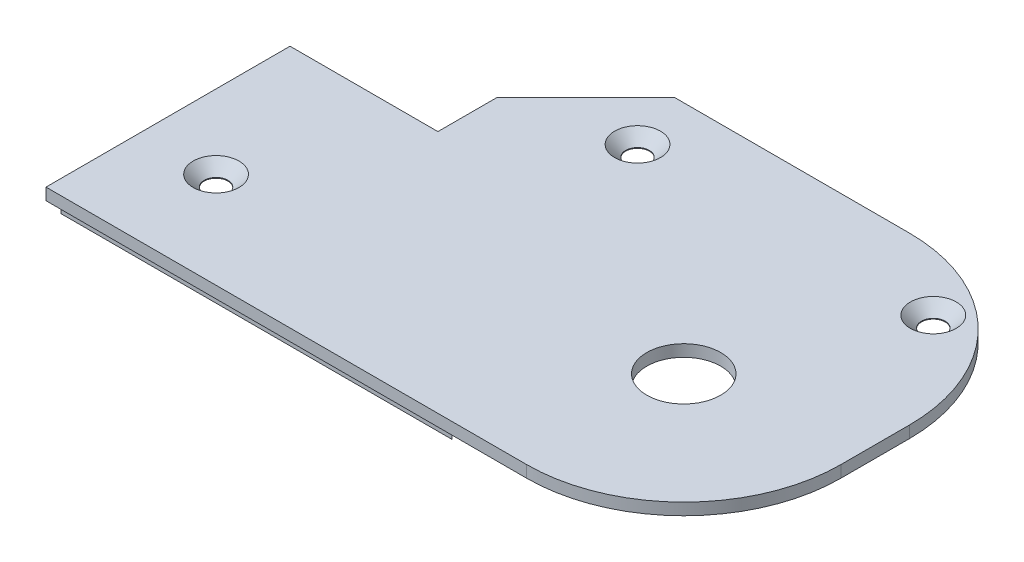
ISO-10303-21;
HEADER;
FILE_DESCRIPTION(('STEP AP214'),'2;1');
FILE_NAME('part.step','',(''),(''),'','','');
FILE_SCHEMA(('AUTOMOTIVE_DESIGN { 1 0 10303 214 1 1 1 1 }'));
ENDSEC;
DATA;
#1=APPLICATION_CONTEXT('core data for automotive mechanical design processes');
#2=APPLICATION_PROTOCOL_DEFINITION('international standard','automotive_design',2000,#1);
#3=PRODUCT_CONTEXT('',#1,'mechanical');
#4=PRODUCT('Part','Part','',(#3));
#5=PRODUCT_RELATED_PRODUCT_CATEGORY('part','',(#4));
#6=PRODUCT_DEFINITION_FORMATION('','',#4);
#7=PRODUCT_DEFINITION_CONTEXT('part definition',#1,'design');
#8=PRODUCT_DEFINITION('design','',#6,#7);
#9=PRODUCT_DEFINITION_SHAPE('','',#8);
#10=(LENGTH_UNIT() NAMED_UNIT(*) SI_UNIT(.MILLI.,.METRE.));
#11=(NAMED_UNIT(*) PLANE_ANGLE_UNIT() SI_UNIT($,.RADIAN.));
#12=(NAMED_UNIT(*) SI_UNIT($,.STERADIAN.) SOLID_ANGLE_UNIT());
#13=UNCERTAINTY_MEASURE_WITH_UNIT(LENGTH_MEASURE(1.E-05),#10,'distance_accuracy_value','');
#14=(GEOMETRIC_REPRESENTATION_CONTEXT(3) GLOBAL_UNCERTAINTY_ASSIGNED_CONTEXT((#13)) GLOBAL_UNIT_ASSIGNED_CONTEXT((#10,
#11,#12)) REPRESENTATION_CONTEXT('',''));
#15=CARTESIAN_POINT('',(0.,0.,0.));
#16=DIRECTION('',(0.,0.,1.));
#17=DIRECTION('',(1.,0.,0.));
#18=AXIS2_PLACEMENT_3D('',#15,#16,#17);
#19=CARTESIAN_POINT('',(0.,-1.165566037737,17.249663072742));
#20=DIRECTION('',(-1.,0.,0.));
#21=DIRECTION('',(0.,0.,1.));
#22=AXIS2_PLACEMENT_3D('',#19,#20,#21);
#23=PLANE('',#22);
#24=DIRECTION('',(0.,0.,1.));
#25=VECTOR('',#24,1.);
#26=CARTESIAN_POINT('',(0.,0.,0.));
#27=LINE('',#26,#25);
#28=CARTESIAN_POINT('',(0.,0.,0.));
#29=VERTEX_POINT('',#28);
#30=CARTESIAN_POINT('',(0.,0.,32.999999999923));
#31=VERTEX_POINT('',#30);
#32=EDGE_CURVE('E10',#29,#31,#27,.T.);
#33=ORIENTED_EDGE('',*,*,#32,.F.);
#34=DIRECTION('',(0.,-1.,0.));
#35=VECTOR('',#34,1.);
#36=CARTESIAN_POINT('',(0.,0.,0.));
#37=LINE('',#36,#35);
#38=CARTESIAN_POINT('',(0.,-1.6,0.));
#39=VERTEX_POINT('',#38);
#40=EDGE_CURVE('E267',#29,#39,#37,.T.);
#41=ORIENTED_EDGE('',*,*,#40,.T.);
#42=DIRECTION('',(0.,0.,1.));
#43=VECTOR('',#42,1.);
#44=CARTESIAN_POINT('',(0.,-1.6,0.));
#45=LINE('',#44,#43);
#46=CARTESIAN_POINT('',(0.,-1.6,24.25));
#47=VERTEX_POINT('',#46);
#48=EDGE_CURVE('E19',#39,#47,#45,.T.);
#49=ORIENTED_EDGE('',*,*,#48,.T.);
#50=DIRECTION('',(0.,-1.,0.));
#51=VECTOR('',#50,1.);
#52=CARTESIAN_POINT('',(0.,0.,24.25));
#53=LINE('',#52,#51);
#54=CARTESIAN_POINT('',(0.,-4.1,24.25));
#55=VERTEX_POINT('',#54);
#56=EDGE_CURVE('E206',#47,#55,#53,.T.);
#57=ORIENTED_EDGE('',*,*,#56,.T.);
#58=DIRECTION('',(0.,0.,1.));
#59=VECTOR('',#58,1.);
#60=CARTESIAN_POINT('',(0.,-4.1,24.25));
#61=LINE('',#60,#59);
#62=CARTESIAN_POINT('',(0.,-4.1,30.999999999999));
#63=VERTEX_POINT('',#62);
#64=EDGE_CURVE('E26',#55,#63,#61,.T.);
#65=ORIENTED_EDGE('',*,*,#64,.T.);
#66=DIRECTION('',(0.,-1.,0.));
#67=VECTOR('',#66,1.);
#68=CARTESIAN_POINT('',(0.,0.,30.999999999999));
#69=LINE('',#68,#67);
#70=CARTESIAN_POINT('',(0.,-1.6,30.999999999999));
#71=VERTEX_POINT('',#70);
#72=EDGE_CURVE('E238',#71,#63,#69,.T.);
#73=ORIENTED_EDGE('',*,*,#72,.F.);
#74=DIRECTION('',(0.,0.,1.));
#75=VECTOR('',#74,1.);
#76=CARTESIAN_POINT('',(0.,-1.6,0.));
#77=LINE('',#76,#75);
#78=CARTESIAN_POINT('',(0.,-1.6,32.999999999923));
#79=VERTEX_POINT('',#78);
#80=EDGE_CURVE('E268',#71,#79,#77,.T.);
#81=ORIENTED_EDGE('',*,*,#80,.T.);
#82=DIRECTION('',(0.,-1.,0.));
#83=VECTOR('',#82,1.);
#84=CARTESIAN_POINT('',(0.,0.,32.999999999923));
#85=LINE('',#84,#83);
#86=EDGE_CURVE('E252',#31,#79,#85,.T.);
#87=ORIENTED_EDGE('',*,*,#86,.F.);
#88=EDGE_LOOP('',(#33,#41,#49,#57,#65,#73,#81,#87));
#89=FACE_BOUND('',#88,.T.);
#90=ADVANCED_FACE('F15',(#89),#23,.T.);
#91=CARTESIAN_POINT('',(42.942869603476,0.,6.905034412528));
#92=DIRECTION('',(0.,-1.,0.));
#93=DIRECTION('',(0.,0.,-1.));
#94=AXIS2_PLACEMENT_3D('',#91,#92,#93);
#95=PLANE('',#94);
#96=CARTESIAN_POINT('',(75.,0.,-12.));
#97=DIRECTION('',(0.,-1.,0.));
#98=DIRECTION('',(1.,0.,0.));
#99=AXIS2_PLACEMENT_3D('',#96,#97,#98);
#100=CIRCLE('',#99,3.1);
#101=CARTESIAN_POINT('',(78.1,0.,-12.));
#102=VERTEX_POINT('',#101);
#103=EDGE_CURVE('E155',#102,#102,#100,.T.);
#104=ORIENTED_EDGE('',*,*,#103,.T.);
#105=EDGE_LOOP('',(#104));
#106=FACE_BOUND('',#105,.T.);
#107=CARTESIAN_POINT('',(35.,0.,-12.));
#108=DIRECTION('',(0.,-1.,0.));
#109=DIRECTION('',(1.,0.,0.));
#110=AXIS2_PLACEMENT_3D('',#107,#108,#109);
#111=CIRCLE('',#110,3.1);
#112=CARTESIAN_POINT('',(38.1,0.,-12.));
#113=VERTEX_POINT('',#112);
#114=EDGE_CURVE('E254',#113,#113,#111,.T.);
#115=ORIENTED_EDGE('',*,*,#114,.T.);
#116=EDGE_LOOP('',(#115));
#117=FACE_BOUND('',#116,.T.);
#118=CARTESIAN_POINT('',(10.,0.,20.));
#119=DIRECTION('',(0.,-1.,0.));
#120=DIRECTION('',(1.,0.,0.));
#121=AXIS2_PLACEMENT_3D('',#118,#119,#120);
#122=CIRCLE('',#121,3.1);
#123=CARTESIAN_POINT('',(13.1,0.,20.));
#124=VERTEX_POINT('',#123);
#125=EDGE_CURVE('E249',#124,#124,#122,.T.);
#126=ORIENTED_EDGE('',*,*,#125,.T.);
#127=EDGE_LOOP('',(#126));
#128=FACE_BOUND('',#127,.T.);
#129=CARTESIAN_POINT('',(65.,0.,11.75));
#130=DIRECTION('',(0.,-1.,0.));
#131=DIRECTION('',(1.,0.,0.));
#132=AXIS2_PLACEMENT_3D('',#129,#130,#131);
#133=CIRCLE('',#132,5.);
#134=CARTESIAN_POINT('',(70.,0.,11.75));
#135=VERTEX_POINT('',#134);
#136=EDGE_CURVE('E223',#135,#135,#133,.T.);
#137=ORIENTED_EDGE('',*,*,#136,.T.);
#138=EDGE_LOOP('',(#137));
#139=FACE_BOUND('',#138,.T.);
#140=DIRECTION('',(1.,0.,0.));
#141=VECTOR('',#140,1.);
#142=CARTESIAN_POINT('',(20.,0.,-20.));
#143=LINE('',#142,#141);
#144=CARTESIAN_POINT('',(32.,0.,-20.));
#145=VERTEX_POINT('',#144);
#146=CARTESIAN_POINT('',(63.75,0.,-20.));
#147=VERTEX_POINT('',#146);
#148=EDGE_CURVE('E261',#145,#147,#143,.T.);
#149=ORIENTED_EDGE('',*,*,#148,.F.);
#150=DIRECTION('',(-0.707106781186548,0.,0.707106781186548));
#151=VECTOR('',#150,1.);
#152=CARTESIAN_POINT('',(25.009458797737,0.,-13.00945879773));
#153=LINE('',#152,#151);
#154=CARTESIAN_POINT('',(20.,0.,-8.));
#155=VERTEX_POINT('',#154);
#156=EDGE_CURVE('E130',#145,#155,#153,.T.);
#157=ORIENTED_EDGE('',*,*,#156,.T.);
#158=DIRECTION('',(0.,0.,-1.));
#159=VECTOR('',#158,1.);
#160=CARTESIAN_POINT('',(20.,0.,0.));
#161=LINE('',#160,#159);
#162=CARTESIAN_POINT('',(20.,0.,0.));
#163=VERTEX_POINT('',#162);
#164=EDGE_CURVE('E313',#163,#155,#161,.T.);
#165=ORIENTED_EDGE('',*,*,#164,.F.);
#166=DIRECTION('',(1.,0.,0.));
#167=VECTOR('',#166,1.);
#168=CARTESIAN_POINT('',(0.,0.,0.));
#169=LINE('',#168,#167);
#170=EDGE_CURVE('E282',#29,#163,#169,.T.);
#171=ORIENTED_EDGE('',*,*,#170,.F.);
#172=ORIENTED_EDGE('',*,*,#32,.T.);
#173=DIRECTION('',(1.,0.,0.));
#174=VECTOR('',#173,1.);
#175=CARTESIAN_POINT('',(0.,0.,32.999999999923));
#176=LINE('',#175,#174);
#177=CARTESIAN_POINT('',(64.999942711714,0.,32.999999999923));
#178=VERTEX_POINT('',#177);
#179=EDGE_CURVE('E227',#31,#178,#176,.T.);
#180=ORIENTED_EDGE('',*,*,#179,.T.);
#181=CARTESIAN_POINT('',(65.,0.,11.75));
#182=DIRECTION('',(0.,-1.,0.));
#183=DIRECTION('',(1.,0.,0.));
#184=AXIS2_PLACEMENT_3D('',#181,#182,#183);
#185=CIRCLE('',#184,21.25);
#186=CARTESIAN_POINT('',(86.25,0.,11.749999632095));
#187=VERTEX_POINT('',#186);
#188=EDGE_CURVE('E262',#187,#178,#185,.T.);
#189=ORIENTED_EDGE('',*,*,#188,.F.);
#190=DIRECTION('',(0.,0.,1.));
#191=VECTOR('',#190,1.);
#192=CARTESIAN_POINT('',(86.25,0.,-20.));
#193=LINE('',#192,#191);
#194=CARTESIAN_POINT('',(86.25,0.,2.5));
#195=VERTEX_POINT('',#194);
#196=EDGE_CURVE('E243',#195,#187,#193,.T.);
#197=ORIENTED_EDGE('',*,*,#196,.F.);
#198=CARTESIAN_POINT('',(63.75,0.,2.5));
#199=DIRECTION('',(0.,-1.,0.));
#200=DIRECTION('',(0.,0.,-1.));
#201=AXIS2_PLACEMENT_3D('',#198,#199,#200);
#202=CIRCLE('',#201,22.5);
#203=EDGE_CURVE('E341',#147,#195,#202,.T.);
#204=ORIENTED_EDGE('',*,*,#203,.F.);
#205=EDGE_LOOP('',(#149,#157,#165,#171,#172,#180,#189,#197,#204));
#206=FACE_BOUND('',#205,.T.);
#207=ADVANCED_FACE('F453',(#106,#117,#128,#139,#206),#95,.F.);
#208=CARTESIAN_POINT('',(25.435206012244,-4.1,27.844848164049));
#209=DIRECTION('',(0.,1.,0.));
#210=DIRECTION('',(1.,0.,0.));
#211=AXIS2_PLACEMENT_3D('',#208,#209,#210);
#212=PLANE('',#211);
#213=DIRECTION('',(1.,0.,0.));
#214=VECTOR('',#213,1.);
#215=CARTESIAN_POINT('',(0.,-4.1,30.999999999999));
#216=LINE('',#215,#214);
#217=CARTESIAN_POINT('',(52.875644347016,-4.1,30.999999999999));
#218=VERTEX_POINT('',#217);
#219=EDGE_CURVE('E200',#63,#218,#216,.T.);
#220=ORIENTED_EDGE('',*,*,#219,.F.);
#221=ORIENTED_EDGE('',*,*,#64,.F.);
#222=DIRECTION('',(1.,0.,0.));
#223=VECTOR('',#222,1.);
#224=CARTESIAN_POINT('',(0.,-4.1,24.25));
#225=LINE('',#224,#223);
#226=CARTESIAN_POINT('',(45.99177809473,-4.1,24.25));
#227=VERTEX_POINT('',#226);
#228=EDGE_CURVE('E198',#55,#227,#225,.T.);
#229=ORIENTED_EDGE('',*,*,#228,.T.);
#230=CARTESIAN_POINT('',(65.,-4.1,11.75));
#231=DIRECTION('',(0.,-1.,0.));
#232=DIRECTION('',(1.,0.,0.));
#233=AXIS2_PLACEMENT_3D('',#230,#231,#232);
#234=CIRCLE('',#233,22.75);
#235=EDGE_CURVE('E235',#218,#227,#234,.T.);
#236=ORIENTED_EDGE('',*,*,#235,.F.);
#237=EDGE_LOOP('',(#220,#221,#229,#236));
#238=FACE_BOUND('',#237,.T.);
#239=ADVANCED_FACE('F195',(#238),#212,.F.);
#240=CARTESIAN_POINT('',(0.,0.,30.999999999999));
#241=DIRECTION('',(0.,0.,1.));
#242=DIRECTION('',(0.,-1.,0.));
#243=AXIS2_PLACEMENT_3D('',#240,#241,#242);
#244=PLANE('',#243);
#245=DIRECTION('',(-1.,0.,0.));
#246=VECTOR('',#245,1.);
#247=CARTESIAN_POINT('',(21.471434801738,-1.6,30.999999999999));
#248=LINE('',#247,#246);
#249=CARTESIAN_POINT('',(52.875644347016,-1.6,30.999999999999));
#250=VERTEX_POINT('',#249);
#251=EDGE_CURVE('E272',#250,#71,#248,.T.);
#252=ORIENTED_EDGE('',*,*,#251,.T.);
#253=ORIENTED_EDGE('',*,*,#72,.T.);
#254=ORIENTED_EDGE('',*,*,#219,.T.);
#255=DIRECTION('',(0.,-1.,0.));
#256=VECTOR('',#255,1.);
#257=CARTESIAN_POINT('',(52.875644347016,0.,30.999999999999));
#258=LINE('',#257,#256);
#259=EDGE_CURVE('E213',#250,#218,#258,.T.);
#260=ORIENTED_EDGE('',*,*,#259,.F.);
#261=EDGE_LOOP('',(#252,#253,#254,#260));
#262=FACE_BOUND('',#261,.T.);
#263=ADVANCED_FACE('F437',(#262),#244,.T.);
#264=CARTESIAN_POINT('',(65.,0.,11.75));
#265=DIRECTION('',(0.,1.,0.));
#266=DIRECTION('',(1.,0.,0.));
#267=AXIS2_PLACEMENT_3D('',#264,#265,#266);
#268=CYLINDRICAL_SURFACE('',#267,22.75);
#269=CARTESIAN_POINT('',(65.,-1.6,11.75));
#270=DIRECTION('',(0.,1.,0.));
#271=DIRECTION('',(1.,0.,0.));
#272=AXIS2_PLACEMENT_3D('',#269,#270,#271);
#273=CIRCLE('',#272,22.75);
#274=CARTESIAN_POINT('',(45.99177809473,-1.6,24.25));
#275=VERTEX_POINT('',#274);
#276=EDGE_CURVE('E290',#275,#250,#273,.T.);
#277=ORIENTED_EDGE('',*,*,#276,.T.);
#278=ORIENTED_EDGE('',*,*,#259,.T.);
#279=ORIENTED_EDGE('',*,*,#235,.T.);
#280=DIRECTION('',(0.,-1.,0.));
#281=VECTOR('',#280,1.);
#282=CARTESIAN_POINT('',(45.99177809473,0.,24.25));
#283=LINE('',#282,#281);
#284=EDGE_CURVE('E216',#275,#227,#283,.T.);
#285=ORIENTED_EDGE('',*,*,#284,.F.);
#286=EDGE_LOOP('',(#277,#278,#279,#285));
#287=FACE_BOUND('',#286,.T.);
#288=ADVANCED_FACE('F440',(#287),#268,.F.);
#289=CARTESIAN_POINT('',(0.,0.,24.25));
#290=DIRECTION('',(0.,0.,1.));
#291=DIRECTION('',(0.,-1.,0.));
#292=AXIS2_PLACEMENT_3D('',#289,#290,#291);
#293=PLANE('',#292);
#294=ORIENTED_EDGE('',*,*,#284,.T.);
#295=ORIENTED_EDGE('',*,*,#228,.F.);
#296=ORIENTED_EDGE('',*,*,#56,.F.);
#297=DIRECTION('',(-1.,0.,0.));
#298=VECTOR('',#297,1.);
#299=CARTESIAN_POINT('',(21.471434801738,-1.6,24.25));
#300=LINE('',#299,#298);
#301=EDGE_CURVE('E294',#275,#47,#300,.T.);
#302=ORIENTED_EDGE('',*,*,#301,.F.);
#303=EDGE_LOOP('',(#294,#295,#296,#302));
#304=FACE_BOUND('',#303,.T.);
#305=ADVANCED_FACE('F215',(#304),#293,.F.);
#306=CARTESIAN_POINT('',(65.,0.,11.75));
#307=DIRECTION('',(0.,1.,0.));
#308=DIRECTION('',(1.,0.,0.));
#309=AXIS2_PLACEMENT_3D('',#306,#307,#308);
#310=CYLINDRICAL_SURFACE('',#309,5.);
#311=DIRECTION('',(0.,-1.,0.));
#312=VECTOR('',#311,1.);
#313=CARTESIAN_POINT('',(70.,0.,11.75));
#314=LINE('',#313,#312);
#315=CARTESIAN_POINT('',(70.,-1.6,11.75));
#316=VERTEX_POINT('',#315);
#317=EDGE_CURVE('E248',#135,#316,#314,.T.);
#318=ORIENTED_EDGE('',*,*,#317,.T.);
#319=CARTESIAN_POINT('',(65.,-1.6,11.75));
#320=DIRECTION('',(0.,-1.,0.));
#321=DIRECTION('',(1.,0.,0.));
#322=AXIS2_PLACEMENT_3D('',#319,#320,#321);
#323=CIRCLE('',#322,5.);
#324=EDGE_CURVE('E273',#316,#316,#323,.T.);
#325=ORIENTED_EDGE('',*,*,#324,.T.);
#326=ORIENTED_EDGE('',*,*,#317,.F.);
#327=ORIENTED_EDGE('',*,*,#136,.F.);
#328=EDGE_LOOP('',(#318,#325,#326,#327));
#329=FACE_BOUND('',#328,.T.);
#330=ADVANCED_FACE('F17',(#329),#310,.F.);
#331=CARTESIAN_POINT('',(10.,0.,20.));
#332=DIRECTION('',(0.,1.,0.));
#333=DIRECTION('',(1.,0.,0.));
#334=AXIS2_PLACEMENT_3D('',#331,#332,#333);
#335=CYLINDRICAL_SURFACE('',#334,1.6);
#336=DIRECTION('',(0.,-1.,0.));
#337=VECTOR('',#336,1.);
#338=CARTESIAN_POINT('',(11.6,0.,20.));
#339=LINE('',#338,#337);
#340=CARTESIAN_POINT('',(11.6,-1.5,20.));
#341=VERTEX_POINT('',#340);
#342=CARTESIAN_POINT('',(11.6,-1.6,20.));
#343=VERTEX_POINT('',#342);
#344=EDGE_CURVE('E245',#341,#343,#339,.T.);
#345=ORIENTED_EDGE('',*,*,#344,.F.);
#346=CARTESIAN_POINT('',(10.,-1.5,20.));
#347=DIRECTION('',(0.,-1.,0.));
#348=DIRECTION('',(1.,0.,0.));
#349=AXIS2_PLACEMENT_3D('',#346,#347,#348);
#350=CIRCLE('',#349,1.6);
#351=EDGE_CURVE('E277',#341,#341,#350,.T.);
#352=ORIENTED_EDGE('',*,*,#351,.F.);
#353=ORIENTED_EDGE('',*,*,#344,.T.);
#354=CARTESIAN_POINT('',(10.,-1.6,20.));
#355=DIRECTION('',(0.,1.,0.));
#356=DIRECTION('',(1.,0.,0.));
#357=AXIS2_PLACEMENT_3D('',#354,#355,#356);
#358=CIRCLE('',#357,1.6);
#359=EDGE_CURVE('E278',#343,#343,#358,.T.);
#360=ORIENTED_EDGE('',*,*,#359,.F.);
#361=EDGE_LOOP('',(#345,#352,#353,#360));
#362=FACE_BOUND('',#361,.T.);
#363=ADVANCED_FACE('F462',(#362),#335,.F.);
#364=CARTESIAN_POINT('',(10.,-1.5,20.));
#365=DIRECTION('',(0.,1.,0.));
#366=DIRECTION('',(1.,0.,0.));
#367=AXIS2_PLACEMENT_3D('',#364,#365,#366);
#368=CONICAL_SURFACE('',#367,1.6,0.785398163397);
#369=ORIENTED_EDGE('',*,*,#351,.T.);
#370=DIRECTION('',(-0.707106781186548,-0.707106781186548,0.));
#371=VECTOR('',#370,1.);
#372=CARTESIAN_POINT('',(11.6,-1.5,20.));
#373=LINE('',#372,#371);
#374=EDGE_CURVE('E384',#124,#341,#373,.T.);
#375=ORIENTED_EDGE('',*,*,#374,.F.);
#376=ORIENTED_EDGE('',*,*,#125,.F.);
#377=ORIENTED_EDGE('',*,*,#374,.T.);
#378=EDGE_LOOP('',(#369,#375,#376,#377));
#379=FACE_BOUND('',#378,.T.);
#380=ADVANCED_FACE('F464',(#379),#368,.F.);
#381=CARTESIAN_POINT('',(42.942869603476,-1.6,6.905034412528));
#382=DIRECTION('',(0.,-1.,0.));
#383=DIRECTION('',(0.,0.,-1.));
#384=AXIS2_PLACEMENT_3D('',#381,#382,#383);
#385=PLANE('',#384);
#386=CARTESIAN_POINT('',(75.,-1.6,-12.));
#387=DIRECTION('',(0.,1.,0.));
#388=DIRECTION('',(1.,0.,0.));
#389=AXIS2_PLACEMENT_3D('',#386,#387,#388);
#390=CIRCLE('',#389,1.6);
#391=CARTESIAN_POINT('',(76.6,-1.6,-12.));
#392=VERTEX_POINT('',#391);
#393=EDGE_CURVE('E164',#392,#392,#390,.T.);
#394=ORIENTED_EDGE('',*,*,#393,.T.);
#395=EDGE_LOOP('',(#394));
#396=FACE_BOUND('',#395,.T.);
#397=ORIENTED_EDGE('',*,*,#324,.F.);
#398=EDGE_LOOP('',(#397));
#399=FACE_BOUND('',#398,.T.);
#400=CARTESIAN_POINT('',(35.,-1.6,-12.));
#401=DIRECTION('',(0.,1.,0.));
#402=DIRECTION('',(1.,0.,0.));
#403=AXIS2_PLACEMENT_3D('',#400,#401,#402);
#404=CIRCLE('',#403,1.6);
#405=CARTESIAN_POINT('',(36.6,-1.6,-12.));
#406=VERTEX_POINT('',#405);
#407=EDGE_CURVE('E234',#406,#406,#404,.T.);
#408=ORIENTED_EDGE('',*,*,#407,.T.);
#409=EDGE_LOOP('',(#408));
#410=FACE_BOUND('',#409,.T.);
#411=ORIENTED_EDGE('',*,*,#359,.T.);
#412=EDGE_LOOP('',(#411));
#413=FACE_BOUND('',#412,.T.);
#414=DIRECTION('',(1.,0.,0.));
#415=VECTOR('',#414,1.);
#416=CARTESIAN_POINT('',(20.,-1.6,-20.));
#417=LINE('',#416,#415);
#418=CARTESIAN_POINT('',(32.,-1.6,-20.));
#419=VERTEX_POINT('',#418);
#420=CARTESIAN_POINT('',(63.75,-1.6,-20.));
#421=VERTEX_POINT('',#420);
#422=EDGE_CURVE('E289',#419,#421,#417,.T.);
#423=ORIENTED_EDGE('',*,*,#422,.T.);
#424=CARTESIAN_POINT('',(63.75,-1.6,2.5));
#425=DIRECTION('',(0.,-1.,0.));
#426=DIRECTION('',(0.,0.,-1.));
#427=AXIS2_PLACEMENT_3D('',#424,#425,#426);
#428=CIRCLE('',#427,22.5);
#429=CARTESIAN_POINT('',(86.25,-1.6,2.5));
#430=VERTEX_POINT('',#429);
#431=EDGE_CURVE('E305',#421,#430,#428,.T.);
#432=ORIENTED_EDGE('',*,*,#431,.T.);
#433=DIRECTION('',(0.,0.,1.));
#434=VECTOR('',#433,1.);
#435=CARTESIAN_POINT('',(86.25,-1.6,-20.));
#436=LINE('',#435,#434);
#437=CARTESIAN_POINT('',(86.25,-1.6,11.749999632095));
#438=VERTEX_POINT('',#437);
#439=EDGE_CURVE('E239',#430,#438,#436,.T.);
#440=ORIENTED_EDGE('',*,*,#439,.T.);
#441=CARTESIAN_POINT('',(65.,-1.6,11.75));
#442=DIRECTION('',(0.,-1.,0.));
#443=DIRECTION('',(1.,0.,0.));
#444=AXIS2_PLACEMENT_3D('',#441,#442,#443);
#445=CIRCLE('',#444,21.25);
#446=CARTESIAN_POINT('',(64.999942711714,-1.6,32.999999999923));
#447=VERTEX_POINT('',#446);
#448=EDGE_CURVE('E345',#438,#447,#445,.T.);
#449=ORIENTED_EDGE('',*,*,#448,.T.);
#450=DIRECTION('',(1.,0.,0.));
#451=VECTOR('',#450,1.);
#452=CARTESIAN_POINT('',(0.,-1.6,32.999999999923));
#453=LINE('',#452,#451);
#454=EDGE_CURVE('E250',#79,#447,#453,.T.);
#455=ORIENTED_EDGE('',*,*,#454,.F.);
#456=ORIENTED_EDGE('',*,*,#80,.F.);
#457=ORIENTED_EDGE('',*,*,#251,.F.);
#458=ORIENTED_EDGE('',*,*,#276,.F.);
#459=ORIENTED_EDGE('',*,*,#301,.T.);
#460=ORIENTED_EDGE('',*,*,#48,.F.);
#461=DIRECTION('',(1.,0.,0.));
#462=VECTOR('',#461,1.);
#463=CARTESIAN_POINT('',(0.,-1.6,0.));
#464=LINE('',#463,#462);
#465=CARTESIAN_POINT('',(20.,-1.6,0.));
#466=VERTEX_POINT('',#465);
#467=EDGE_CURVE('E279',#39,#466,#464,.T.);
#468=ORIENTED_EDGE('',*,*,#467,.T.);
#469=DIRECTION('',(0.,0.,-1.));
#470=VECTOR('',#469,1.);
#471=CARTESIAN_POINT('',(20.,-1.6,0.));
#472=LINE('',#471,#470);
#473=CARTESIAN_POINT('',(20.,-1.6,-8.));
#474=VERTEX_POINT('',#473);
#475=EDGE_CURVE('E309',#466,#474,#472,.T.);
#476=ORIENTED_EDGE('',*,*,#475,.T.);
#477=DIRECTION('',(-0.707106781186548,0.,0.707106781186548));
#478=VECTOR('',#477,1.);
#479=CARTESIAN_POINT('',(25.009458797737,-1.6,-13.00945879773));
#480=LINE('',#479,#478);
#481=EDGE_CURVE('E142',#419,#474,#480,.T.);
#482=ORIENTED_EDGE('',*,*,#481,.F.);
#483=EDGE_LOOP('',(#423,#432,#440,#449,#455,#456,#457,#458,#459,#460,#468,#476,#482));
#484=FACE_BOUND('',#483,.T.);
#485=ADVANCED_FACE('F418',(#396,#399,#410,#413,#484),#385,.T.);
#486=CARTESIAN_POINT('',(0.,0.,32.999999999923));
#487=DIRECTION('',(0.,0.,1.));
#488=DIRECTION('',(0.,-1.,0.));
#489=AXIS2_PLACEMENT_3D('',#486,#487,#488);
#490=PLANE('',#489);
#491=ORIENTED_EDGE('',*,*,#86,.T.);
#492=ORIENTED_EDGE('',*,*,#454,.T.);
#493=DIRECTION('',(0.,-1.,0.));
#494=VECTOR('',#493,1.);
#495=CARTESIAN_POINT('',(64.999942711714,0.,32.999999999923));
#496=LINE('',#495,#494);
#497=EDGE_CURVE('E266',#178,#447,#496,.T.);
#498=ORIENTED_EDGE('',*,*,#497,.F.);
#499=ORIENTED_EDGE('',*,*,#179,.F.);
#500=EDGE_LOOP('',(#491,#492,#498,#499));
#501=FACE_BOUND('',#500,.T.);
#502=ADVANCED_FACE('F429',(#501),#490,.T.);
#503=CARTESIAN_POINT('',(65.,0.,11.75));
#504=DIRECTION('',(0.,1.,0.));
#505=DIRECTION('',(1.,0.,0.));
#506=AXIS2_PLACEMENT_3D('',#503,#504,#505);
#507=CYLINDRICAL_SURFACE('',#506,21.25);
#508=ORIENTED_EDGE('',*,*,#188,.T.);
#509=ORIENTED_EDGE('',*,*,#497,.T.);
#510=ORIENTED_EDGE('',*,*,#448,.F.);
#511=DIRECTION('',(0.,-1.,0.));
#512=VECTOR('',#511,1.);
#513=CARTESIAN_POINT('',(86.25,0.,11.749999632095));
#514=LINE('',#513,#512);
#515=EDGE_CURVE('E244',#187,#438,#514,.T.);
#516=ORIENTED_EDGE('',*,*,#515,.F.);
#517=EDGE_LOOP('',(#508,#509,#510,#516));
#518=FACE_BOUND('',#517,.T.);
#519=ADVANCED_FACE('F425',(#518),#507,.T.);
#520=CARTESIAN_POINT('',(0.,0.,0.));
#521=DIRECTION('',(0.,0.,1.));
#522=DIRECTION('',(0.,-1.,0.));
#523=AXIS2_PLACEMENT_3D('',#520,#521,#522);
#524=PLANE('',#523);
#525=ORIENTED_EDGE('',*,*,#170,.T.);
#526=DIRECTION('',(0.,-1.,0.));
#527=VECTOR('',#526,1.);
#528=CARTESIAN_POINT('',(20.,0.,0.));
#529=LINE('',#528,#527);
#530=EDGE_CURVE('E314',#163,#466,#529,.T.);
#531=ORIENTED_EDGE('',*,*,#530,.T.);
#532=ORIENTED_EDGE('',*,*,#467,.F.);
#533=ORIENTED_EDGE('',*,*,#40,.F.);
#534=EDGE_LOOP('',(#525,#531,#532,#533));
#535=FACE_BOUND('',#534,.T.);
#536=ADVANCED_FACE('F576',(#535),#524,.F.);
#537=CARTESIAN_POINT('',(86.25,0.,-20.));
#538=DIRECTION('',(-1.,0.,0.));
#539=DIRECTION('',(0.,0.,1.));
#540=AXIS2_PLACEMENT_3D('',#537,#538,#539);
#541=PLANE('',#540);
#542=ORIENTED_EDGE('',*,*,#515,.T.);
#543=ORIENTED_EDGE('',*,*,#439,.F.);
#544=DIRECTION('',(0.,-1.,0.));
#545=VECTOR('',#544,1.);
#546=CARTESIAN_POINT('',(86.25,0.,2.5));
#547=LINE('',#546,#545);
#548=EDGE_CURVE('E310',#195,#430,#547,.T.);
#549=ORIENTED_EDGE('',*,*,#548,.F.);
#550=ORIENTED_EDGE('',*,*,#196,.T.);
#551=EDGE_LOOP('',(#542,#543,#549,#550));
#552=FACE_BOUND('',#551,.T.);
#553=ADVANCED_FACE('F422',(#552),#541,.F.);
#554=CARTESIAN_POINT('',(20.,0.,0.));
#555=DIRECTION('',(1.,0.,0.));
#556=DIRECTION('',(0.,1.,0.));
#557=AXIS2_PLACEMENT_3D('',#554,#555,#556);
#558=PLANE('',#557);
#559=DIRECTION('',(0.,-1.,0.));
#560=VECTOR('',#559,1.);
#561=CARTESIAN_POINT('',(20.,0.,-8.));
#562=LINE('',#561,#560);
#563=EDGE_CURVE('E334',#155,#474,#562,.T.);
#564=ORIENTED_EDGE('',*,*,#563,.T.);
#565=ORIENTED_EDGE('',*,*,#475,.F.);
#566=ORIENTED_EDGE('',*,*,#530,.F.);
#567=ORIENTED_EDGE('',*,*,#164,.T.);
#568=EDGE_LOOP('',(#564,#565,#566,#567));
#569=FACE_BOUND('',#568,.T.);
#570=ADVANCED_FACE('F629',(#569),#558,.F.);
#571=CARTESIAN_POINT('',(63.75,0.,2.5));
#572=DIRECTION('',(0.,-1.,0.));
#573=DIRECTION('',(0.,0.,-1.));
#574=AXIS2_PLACEMENT_3D('',#571,#572,#573);
#575=CYLINDRICAL_SURFACE('',#574,22.5);
#576=ORIENTED_EDGE('',*,*,#203,.T.);
#577=ORIENTED_EDGE('',*,*,#548,.T.);
#578=ORIENTED_EDGE('',*,*,#431,.F.);
#579=DIRECTION('',(0.,-1.,0.));
#580=VECTOR('',#579,1.);
#581=CARTESIAN_POINT('',(63.75,0.,-20.));
#582=LINE('',#581,#580);
#583=EDGE_CURVE('E299',#147,#421,#582,.T.);
#584=ORIENTED_EDGE('',*,*,#583,.F.);
#585=EDGE_LOOP('',(#576,#577,#578,#584));
#586=FACE_BOUND('',#585,.T.);
#587=ADVANCED_FACE('F416',(#586),#575,.T.);
#588=CARTESIAN_POINT('',(26.,0.,-14.));
#589=DIRECTION('',(-0.707106781186548,0.,-0.707106781186548));
#590=DIRECTION('',(-0.707106781186548,0.,0.707106781186548));
#591=AXIS2_PLACEMENT_3D('',#588,#589,#590);
#592=PLANE('',#591);
#593=ORIENTED_EDGE('',*,*,#156,.F.);
#594=DIRECTION('',(0.,-1.,0.));
#595=VECTOR('',#594,1.);
#596=CARTESIAN_POINT('',(32.,0.,-20.));
#597=LINE('',#596,#595);
#598=EDGE_CURVE('E286',#145,#419,#597,.T.);
#599=ORIENTED_EDGE('',*,*,#598,.T.);
#600=ORIENTED_EDGE('',*,*,#481,.T.);
#601=ORIENTED_EDGE('',*,*,#563,.F.);
#602=EDGE_LOOP('',(#593,#599,#600,#601));
#603=FACE_BOUND('',#602,.T.);
#604=ADVANCED_FACE('F552',(#603),#592,.T.);
#605=CARTESIAN_POINT('',(20.,0.,-20.));
#606=DIRECTION('',(0.,0.,1.));
#607=DIRECTION('',(0.,-1.,0.));
#608=AXIS2_PLACEMENT_3D('',#605,#606,#607);
#609=PLANE('',#608);
#610=ORIENTED_EDGE('',*,*,#583,.T.);
#611=ORIENTED_EDGE('',*,*,#422,.F.);
#612=ORIENTED_EDGE('',*,*,#598,.F.);
#613=ORIENTED_EDGE('',*,*,#148,.T.);
#614=EDGE_LOOP('',(#610,#611,#612,#613));
#615=FACE_BOUND('',#614,.T.);
#616=ADVANCED_FACE('F412',(#615),#609,.F.);
#617=CARTESIAN_POINT('',(75.,0.,-12.));
#618=DIRECTION('',(0.,1.,0.));
#619=DIRECTION('',(1.,0.,0.));
#620=AXIS2_PLACEMENT_3D('',#617,#618,#619);
#621=CYLINDRICAL_SURFACE('',#620,1.6);
#622=DIRECTION('',(0.,-1.,0.));
#623=VECTOR('',#622,1.);
#624=CARTESIAN_POINT('',(76.6,0.,-12.));
#625=LINE('',#624,#623);
#626=CARTESIAN_POINT('',(76.6,-1.5,-12.));
#627=VERTEX_POINT('',#626);
#628=EDGE_CURVE('E300',#627,#392,#625,.T.);
#629=ORIENTED_EDGE('',*,*,#628,.F.);
#630=CARTESIAN_POINT('',(75.,-1.5,-12.));
#631=DIRECTION('',(0.,-1.,0.));
#632=DIRECTION('',(1.,0.,0.));
#633=AXIS2_PLACEMENT_3D('',#630,#631,#632);
#634=CIRCLE('',#633,1.6);
#635=EDGE_CURVE('E229',#627,#627,#634,.T.);
#636=ORIENTED_EDGE('',*,*,#635,.F.);
#637=ORIENTED_EDGE('',*,*,#628,.T.);
#638=ORIENTED_EDGE('',*,*,#393,.F.);
#639=EDGE_LOOP('',(#629,#636,#637,#638));
#640=FACE_BOUND('',#639,.T.);
#641=ADVANCED_FACE('F551',(#640),#621,.F.);
#642=CARTESIAN_POINT('',(75.,-1.5,-12.));
#643=DIRECTION('',(0.,1.,0.));
#644=DIRECTION('',(1.,0.,0.));
#645=AXIS2_PLACEMENT_3D('',#642,#643,#644);
#646=CONICAL_SURFACE('',#645,1.6,0.785398163397);
#647=ORIENTED_EDGE('',*,*,#635,.T.);
#648=DIRECTION('',(-0.707106781186548,-0.707106781186548,0.));
#649=VECTOR('',#648,1.);
#650=CARTESIAN_POINT('',(76.6,-1.5,-12.));
#651=LINE('',#650,#649);
#652=EDGE_CURVE('E233',#102,#627,#651,.T.);
#653=ORIENTED_EDGE('',*,*,#652,.F.);
#654=ORIENTED_EDGE('',*,*,#103,.F.);
#655=ORIENTED_EDGE('',*,*,#652,.T.);
#656=EDGE_LOOP('',(#647,#653,#654,#655));
#657=FACE_BOUND('',#656,.T.);
#658=ADVANCED_FACE('F604',(#657),#646,.F.);
#659=CARTESIAN_POINT('',(35.,0.,-12.));
#660=DIRECTION('',(0.,1.,0.));
#661=DIRECTION('',(1.,0.,0.));
#662=AXIS2_PLACEMENT_3D('',#659,#660,#661);
#663=CYLINDRICAL_SURFACE('',#662,1.6);
#664=DIRECTION('',(0.,-1.,0.));
#665=VECTOR('',#664,1.);
#666=CARTESIAN_POINT('',(36.6,0.,-12.));
#667=LINE('',#666,#665);
#668=CARTESIAN_POINT('',(36.6,-1.5,-12.));
#669=VERTEX_POINT('',#668);
#670=EDGE_CURVE('E257',#669,#406,#667,.T.);
#671=ORIENTED_EDGE('',*,*,#670,.F.);
#672=CARTESIAN_POINT('',(35.,-1.5,-12.));
#673=DIRECTION('',(0.,-1.,0.));
#674=DIRECTION('',(1.,0.,0.));
#675=AXIS2_PLACEMENT_3D('',#672,#673,#674);
#676=CIRCLE('',#675,1.6);
#677=EDGE_CURVE('E301',#669,#669,#676,.T.);
#678=ORIENTED_EDGE('',*,*,#677,.F.);
#679=ORIENTED_EDGE('',*,*,#670,.T.);
#680=ORIENTED_EDGE('',*,*,#407,.F.);
#681=EDGE_LOOP('',(#671,#678,#679,#680));
#682=FACE_BOUND('',#681,.T.);
#683=ADVANCED_FACE('F480',(#682),#663,.F.);
#684=CARTESIAN_POINT('',(35.,-1.5,-12.));
#685=DIRECTION('',(0.,1.,0.));
#686=DIRECTION('',(1.,0.,0.));
#687=AXIS2_PLACEMENT_3D('',#684,#685,#686);
#688=CONICAL_SURFACE('',#687,1.6,0.785398163397);
#689=ORIENTED_EDGE('',*,*,#677,.T.);
#690=DIRECTION('',(-0.707106781186548,-0.707106781186548,0.));
#691=VECTOR('',#690,1.);
#692=CARTESIAN_POINT('',(36.6,-1.5,-12.));
#693=LINE('',#692,#691);
#694=EDGE_CURVE('E258',#113,#669,#693,.T.);
#695=ORIENTED_EDGE('',*,*,#694,.F.);
#696=ORIENTED_EDGE('',*,*,#114,.F.);
#697=ORIENTED_EDGE('',*,*,#694,.T.);
#698=EDGE_LOOP('',(#689,#695,#696,#697));
#699=FACE_BOUND('',#698,.T.);
#700=ADVANCED_FACE('F622',(#699),#688,.F.);
#701=CLOSED_SHELL('',(#90,#207,#239,#263,#288,#305,#330,#363,#380,#485,#502,#519,#536,#553,#570,
#587,#604,#616,#641,#658,#683,#700));
#702=MANIFOLD_SOLID_BREP('B1',#701);
#703=ADVANCED_BREP_SHAPE_REPRESENTATION('',(#18,#702),#14);
#704=SHAPE_DEFINITION_REPRESENTATION(#9,#703);
ENDSEC;
END-ISO-10303-21;
